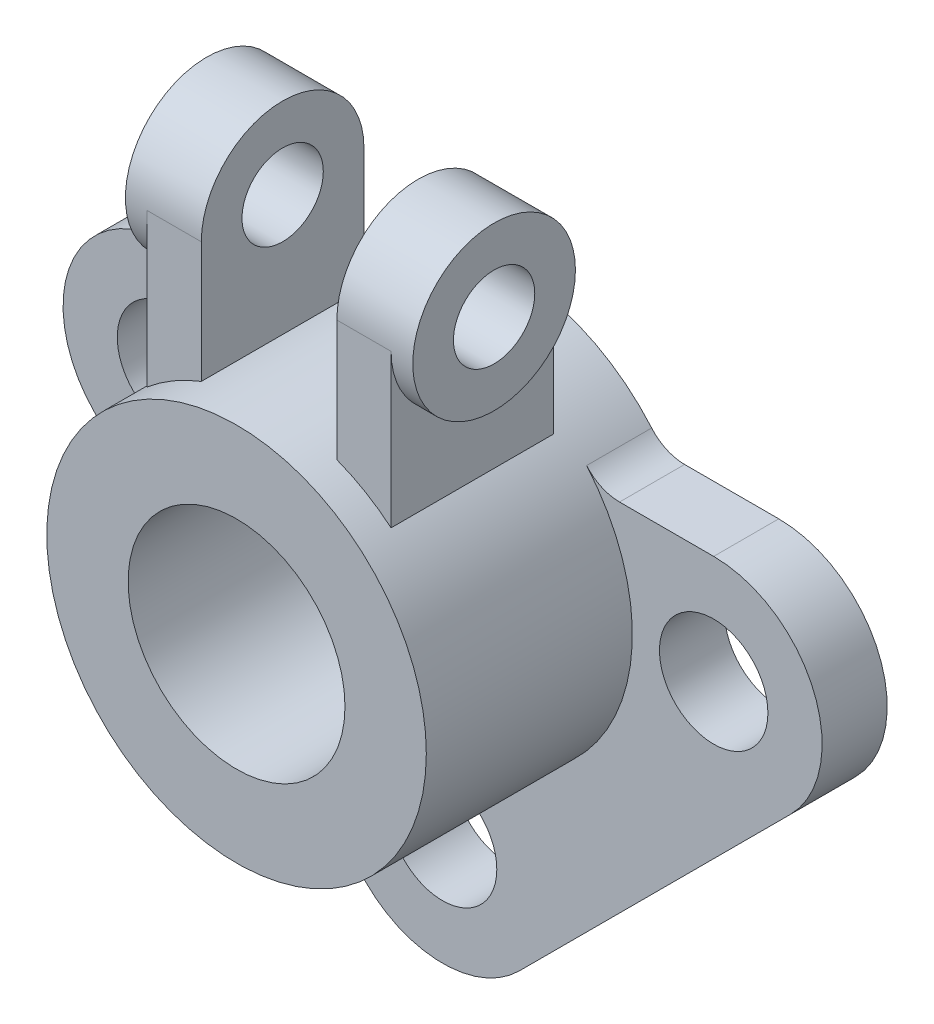
ISO-10303-21;
HEADER;
FILE_DESCRIPTION(('STEP AP214'),'2;1');
FILE_NAME('part.step','',(''),(''),'','','');
FILE_SCHEMA(('AUTOMOTIVE_DESIGN { 1 0 10303 214 1 1 1 1 }'));
ENDSEC;
DATA;
#1=APPLICATION_CONTEXT('core data for automotive mechanical design processes');
#2=APPLICATION_PROTOCOL_DEFINITION('international standard','automotive_design',2000,#1);
#3=PRODUCT_CONTEXT('',#1,'mechanical');
#4=PRODUCT('Part','Part','',(#3));
#5=PRODUCT_RELATED_PRODUCT_CATEGORY('part','',(#4));
#6=PRODUCT_DEFINITION_FORMATION('','',#4);
#7=PRODUCT_DEFINITION_CONTEXT('part definition',#1,'design');
#8=PRODUCT_DEFINITION('design','',#6,#7);
#9=PRODUCT_DEFINITION_SHAPE('','',#8);
#10=(LENGTH_UNIT() NAMED_UNIT(*) SI_UNIT(.MILLI.,.METRE.));
#11=(NAMED_UNIT(*) PLANE_ANGLE_UNIT() SI_UNIT($,.RADIAN.));
#12=(NAMED_UNIT(*) SI_UNIT($,.STERADIAN.) SOLID_ANGLE_UNIT());
#13=UNCERTAINTY_MEASURE_WITH_UNIT(LENGTH_MEASURE(1.E-05),#10,'distance_accuracy_value','');
#14=(GEOMETRIC_REPRESENTATION_CONTEXT(3) GLOBAL_UNCERTAINTY_ASSIGNED_CONTEXT((#13)) GLOBAL_UNIT_ASSIGNED_CONTEXT((#10,
#11,#12)) REPRESENTATION_CONTEXT('',''));
#15=CARTESIAN_POINT('',(0.,0.,0.));
#16=DIRECTION('',(0.,0.,1.));
#17=DIRECTION('',(1.,0.,0.));
#18=AXIS2_PLACEMENT_3D('',#15,#16,#17);
#19=CARTESIAN_POINT('',(22.5,0.,14.));
#20=DIRECTION('',(-1.,0.,0.));
#21=DIRECTION('',(0.,0.,1.));
#22=AXIS2_PLACEMENT_3D('',#19,#20,#21);
#23=PLANE('',#22);
#24=CARTESIAN_POINT('',(22.5,55.,29.));
#25=DIRECTION('',(1.,0.,0.));
#26=DIRECTION('',(0.,0.,-1.));
#27=AXIS2_PLACEMENT_3D('',#24,#25,#26);
#28=CIRCLE('',#27,15.);
#29=CARTESIAN_POINT('',(22.5,55.,44.));
#30=VERTEX_POINT('',#29);
#31=CARTESIAN_POINT('',(22.5,55.,14.));
#32=VERTEX_POINT('',#31);
#33=EDGE_CURVE('E219',#30,#32,#28,.T.);
#34=ORIENTED_EDGE('',*,*,#33,.F.);
#35=DIRECTION('',(0.,-1.,0.));
#36=VECTOR('',#35,1.);
#37=CARTESIAN_POINT('',(22.5,0.,44.));
#38=LINE('',#37,#36);
#39=CARTESIAN_POINT('',(22.5,26.809513236909,44.));
#40=VERTEX_POINT('',#39);
#41=EDGE_CURVE('E231',#30,#40,#38,.T.);
#42=ORIENTED_EDGE('',*,*,#41,.T.);
#43=DIRECTION('',(0.,0.,1.));
#44=VECTOR('',#43,1.);
#45=CARTESIAN_POINT('',(22.5,26.809513236909,14.));
#46=LINE('',#45,#44);
#47=CARTESIAN_POINT('',(22.5,26.809513236909,14.));
#48=VERTEX_POINT('',#47);
#49=EDGE_CURVE('E247',#48,#40,#46,.T.);
#50=ORIENTED_EDGE('',*,*,#49,.F.);
#51=DIRECTION('',(0.,-1.,0.));
#52=VECTOR('',#51,1.);
#53=CARTESIAN_POINT('',(22.5,0.,14.));
#54=LINE('',#53,#52);
#55=EDGE_CURVE('E232',#32,#48,#54,.T.);
#56=ORIENTED_EDGE('',*,*,#55,.F.);
#57=EDGE_LOOP('',(#34,#42,#50,#56));
#58=FACE_BOUND('',#57,.T.);
#59=ADVANCED_FACE('F57',(#58),#23,.F.);
#60=CARTESIAN_POINT('',(-22.5,0.,14.));
#61=DIRECTION('',(-1.,0.,0.));
#62=DIRECTION('',(0.,0.,1.));
#63=AXIS2_PLACEMENT_3D('',#60,#61,#62);
#64=PLANE('',#63);
#65=CARTESIAN_POINT('',(-22.5,55.,29.));
#66=DIRECTION('',(1.,0.,0.));
#67=DIRECTION('',(0.,0.,-1.));
#68=AXIS2_PLACEMENT_3D('',#65,#66,#67);
#69=CIRCLE('',#68,15.);
#70=CARTESIAN_POINT('',(-22.5,55.,44.));
#71=VERTEX_POINT('',#70);
#72=CARTESIAN_POINT('',(-22.5,55.,14.));
#73=VERTEX_POINT('',#72);
#74=EDGE_CURVE('E201',#71,#73,#69,.T.);
#75=ORIENTED_EDGE('',*,*,#74,.T.);
#76=DIRECTION('',(0.,-1.,0.));
#77=VECTOR('',#76,1.);
#78=CARTESIAN_POINT('',(-22.5,0.,14.));
#79=LINE('',#78,#77);
#80=CARTESIAN_POINT('',(-22.5,26.809513236909,14.));
#81=VERTEX_POINT('',#80);
#82=EDGE_CURVE('E182',#73,#81,#79,.T.);
#83=ORIENTED_EDGE('',*,*,#82,.T.);
#84=DIRECTION('',(0.,0.,1.));
#85=VECTOR('',#84,1.);
#86=CARTESIAN_POINT('',(-22.5,26.809513236909,14.));
#87=LINE('',#86,#85);
#88=CARTESIAN_POINT('',(-22.5,26.809513236909,44.));
#89=VERTEX_POINT('',#88);
#90=EDGE_CURVE('E260',#81,#89,#87,.T.);
#91=ORIENTED_EDGE('',*,*,#90,.T.);
#92=DIRECTION('',(0.,-1.,0.));
#93=VECTOR('',#92,1.);
#94=CARTESIAN_POINT('',(-22.5,0.,44.));
#95=LINE('',#94,#93);
#96=EDGE_CURVE('E207',#71,#89,#95,.T.);
#97=ORIENTED_EDGE('',*,*,#96,.F.);
#98=EDGE_LOOP('',(#75,#83,#91,#97));
#99=FACE_BOUND('',#98,.T.);
#100=ADVANCED_FACE('F206',(#99),#64,.T.);
#101=CARTESIAN_POINT('',(-12.5,0.,14.));
#102=DIRECTION('',(1.,0.,0.));
#103=DIRECTION('',(0.,0.,-1.));
#104=AXIS2_PLACEMENT_3D('',#101,#102,#103);
#105=PLANE('',#104);
#106=CARTESIAN_POINT('',(-12.5,55.,29.));
#107=DIRECTION('',(1.,0.,0.));
#108=DIRECTION('',(0.,0.,-1.));
#109=AXIS2_PLACEMENT_3D('',#106,#107,#108);
#110=CIRCLE('',#109,7.5);
#111=CARTESIAN_POINT('',(-12.5,55.,21.5));
#112=VERTEX_POINT('',#111);
#113=EDGE_CURVE('E228',#112,#112,#110,.T.);
#114=ORIENTED_EDGE('',*,*,#113,.F.);
#115=EDGE_LOOP('',(#114));
#116=FACE_BOUND('',#115,.T.);
#117=DIRECTION('',(0.,1.,0.));
#118=VECTOR('',#117,1.);
#119=CARTESIAN_POINT('',(-12.5,0.,14.));
#120=LINE('',#119,#118);
#121=CARTESIAN_POINT('',(-12.5,32.6917420765551,14.));
#122=VERTEX_POINT('',#121);
#123=CARTESIAN_POINT('',(-12.5,55.,14.));
#124=VERTEX_POINT('',#123);
#125=EDGE_CURVE('E195',#122,#124,#120,.T.);
#126=ORIENTED_EDGE('',*,*,#125,.T.);
#127=CARTESIAN_POINT('',(-12.5,55.,29.));
#128=DIRECTION('',(1.,0.,0.));
#129=DIRECTION('',(0.,0.,-1.));
#130=AXIS2_PLACEMENT_3D('',#127,#128,#129);
#131=CIRCLE('',#130,15.);
#132=CARTESIAN_POINT('',(-12.5,55.,44.));
#133=VERTEX_POINT('',#132);
#134=EDGE_CURVE('E203',#124,#133,#131,.T.);
#135=ORIENTED_EDGE('',*,*,#134,.T.);
#136=DIRECTION('',(0.,1.,0.));
#137=VECTOR('',#136,1.);
#138=CARTESIAN_POINT('',(-12.5,0.,44.));
#139=LINE('',#138,#137);
#140=CARTESIAN_POINT('',(-12.5,32.6917420765551,44.));
#141=VERTEX_POINT('',#140);
#142=EDGE_CURVE('E257',#141,#133,#139,.T.);
#143=ORIENTED_EDGE('',*,*,#142,.F.);
#144=DIRECTION('',(0.,0.,1.));
#145=VECTOR('',#144,1.);
#146=CARTESIAN_POINT('',(-12.5,32.6917420765551,14.));
#147=LINE('',#146,#145);
#148=EDGE_CURVE('E194',#122,#141,#147,.T.);
#149=ORIENTED_EDGE('',*,*,#148,.F.);
#150=EDGE_LOOP('',(#126,#135,#143,#149));
#151=FACE_BOUND('',#150,.T.);
#152=ADVANCED_FACE('F408',(#116,#151),#105,.T.);
#153=CARTESIAN_POINT('',(12.5,0.,14.));
#154=DIRECTION('',(1.,0.,0.));
#155=DIRECTION('',(0.,0.,-1.));
#156=AXIS2_PLACEMENT_3D('',#153,#154,#155);
#157=PLANE('',#156);
#158=CARTESIAN_POINT('',(12.5,55.,29.));
#159=DIRECTION('',(1.,0.,0.));
#160=DIRECTION('',(0.,0.,-1.));
#161=AXIS2_PLACEMENT_3D('',#158,#159,#160);
#162=CIRCLE('',#161,7.5);
#163=CARTESIAN_POINT('',(12.5,55.,21.5));
#164=VERTEX_POINT('',#163);
#165=EDGE_CURVE('E227',#164,#164,#162,.T.);
#166=ORIENTED_EDGE('',*,*,#165,.T.);
#167=EDGE_LOOP('',(#166));
#168=FACE_BOUND('',#167,.T.);
#169=CARTESIAN_POINT('',(12.5,55.,29.));
#170=DIRECTION('',(1.,0.,0.));
#171=DIRECTION('',(0.,0.,-1.));
#172=AXIS2_PLACEMENT_3D('',#169,#170,#171);
#173=CIRCLE('',#172,15.);
#174=CARTESIAN_POINT('',(12.5,55.,14.));
#175=VERTEX_POINT('',#174);
#176=CARTESIAN_POINT('',(12.5,55.,44.));
#177=VERTEX_POINT('',#176);
#178=EDGE_CURVE('E80',#175,#177,#173,.T.);
#179=ORIENTED_EDGE('',*,*,#178,.F.);
#180=DIRECTION('',(0.,1.,0.));
#181=VECTOR('',#180,1.);
#182=CARTESIAN_POINT('',(12.5,0.,14.));
#183=LINE('',#182,#181);
#184=CARTESIAN_POINT('',(12.5,32.6917420765551,14.));
#185=VERTEX_POINT('',#184);
#186=EDGE_CURVE('E234',#185,#175,#183,.T.);
#187=ORIENTED_EDGE('',*,*,#186,.F.);
#188=DIRECTION('',(0.,0.,1.));
#189=VECTOR('',#188,1.);
#190=CARTESIAN_POINT('',(12.5,32.6917420765551,14.));
#191=LINE('',#190,#189);
#192=CARTESIAN_POINT('',(12.5,32.6917420765551,44.));
#193=VERTEX_POINT('',#192);
#194=EDGE_CURVE('E240',#185,#193,#191,.T.);
#195=ORIENTED_EDGE('',*,*,#194,.T.);
#196=DIRECTION('',(0.,1.,0.));
#197=VECTOR('',#196,1.);
#198=CARTESIAN_POINT('',(12.5,0.,44.));
#199=LINE('',#198,#197);
#200=EDGE_CURVE('E242',#193,#177,#199,.T.);
#201=ORIENTED_EDGE('',*,*,#200,.T.);
#202=EDGE_LOOP('',(#179,#187,#195,#201));
#203=FACE_BOUND('',#202,.T.);
#204=ADVANCED_FACE('F386',(#168,#203),#157,.F.);
#205=CARTESIAN_POINT('',(0.,0.,50.));
#206=DIRECTION('',(0.,0.,-1.));
#207=DIRECTION('',(-1.,0.,0.));
#208=AXIS2_PLACEMENT_3D('',#205,#206,#207);
#209=CYLINDRICAL_SURFACE('',#208,35.);
#210=CARTESIAN_POINT('',(0.,0.,14.));
#211=DIRECTION('',(0.,0.,1.));
#212=DIRECTION('',(1.,0.,0.));
#213=AXIS2_PLACEMENT_3D('',#210,#211,#212);
#214=CIRCLE('',#213,35.);
#215=EDGE_CURVE('E189',#122,#81,#214,.T.);
#216=ORIENTED_EDGE('',*,*,#215,.F.);
#217=ORIENTED_EDGE('',*,*,#148,.T.);
#218=CARTESIAN_POINT('',(0.,0.,44.));
#219=DIRECTION('',(0.,0.,1.));
#220=DIRECTION('',(1.,0.,0.));
#221=AXIS2_PLACEMENT_3D('',#218,#219,#220);
#222=CIRCLE('',#221,35.);
#223=EDGE_CURVE('E250',#141,#89,#222,.T.);
#224=ORIENTED_EDGE('',*,*,#223,.T.);
#225=ORIENTED_EDGE('',*,*,#90,.F.);
#226=EDGE_LOOP('',(#216,#217,#224,#225));
#227=FACE_BOUND('',#226,.T.);
#228=CARTESIAN_POINT('',(0.,0.,50.));
#229=DIRECTION('',(0.,0.,1.));
#230=DIRECTION('',(1.,0.,0.));
#231=AXIS2_PLACEMENT_3D('',#228,#229,#230);
#232=CIRCLE('',#231,35.);
#233=CARTESIAN_POINT('',(35.,0.,50.));
#234=VERTEX_POINT('',#233);
#235=EDGE_CURVE('E268',#234,#234,#232,.T.);
#236=ORIENTED_EDGE('',*,*,#235,.F.);
#237=EDGE_LOOP('',(#236));
#238=FACE_BOUND('',#237,.T.);
#239=CARTESIAN_POINT('',(0.,0.,0.));
#240=DIRECTION('',(0.,0.,1.));
#241=DIRECTION('',(1.,0.,0.));
#242=AXIS2_PLACEMENT_3D('',#239,#240,#241);
#243=CIRCLE('',#242,35.);
#244=CARTESIAN_POINT('',(26.5628330475733,22.7906976744186,0.));
#245=VERTEX_POINT('',#244);
#246=CARTESIAN_POINT('',(-26.5628330475733,22.7906976744186,0.));
#247=VERTEX_POINT('',#246);
#248=EDGE_CURVE('E269',#245,#247,#243,.T.);
#249=ORIENTED_EDGE('',*,*,#248,.T.);
#250=DIRECTION('',(0.,0.,-1.));
#251=VECTOR('',#250,1.);
#252=CARTESIAN_POINT('',(-26.5628330475733,22.7906976744186,50.));
#253=LINE('',#252,#251);
#254=CARTESIAN_POINT('',(-26.5628330475733,22.7906976744186,12.));
#255=VERTEX_POINT('',#254);
#256=EDGE_CURVE('E357',#247,#255,#253,.F.);
#257=ORIENTED_EDGE('',*,*,#256,.T.);
#258=CARTESIAN_POINT('',(0.,0.,12.));
#259=DIRECTION('',(0.,0.,1.));
#260=DIRECTION('',(1.,0.,0.));
#261=AXIS2_PLACEMENT_3D('',#258,#259,#260);
#262=CIRCLE('',#261,35.);
#263=CARTESIAN_POINT('',(26.5628330475733,22.7906976744186,12.));
#264=VERTEX_POINT('',#263);
#265=EDGE_CURVE('E284',#255,#264,#262,.T.);
#266=ORIENTED_EDGE('',*,*,#265,.T.);
#267=DIRECTION('',(0.,0.,-1.));
#268=VECTOR('',#267,1.);
#269=CARTESIAN_POINT('',(26.5628330475733,22.7906976744186,50.));
#270=LINE('',#269,#268);
#271=EDGE_CURVE('E354',#264,#245,#270,.T.);
#272=ORIENTED_EDGE('',*,*,#271,.T.);
#273=EDGE_LOOP('',(#249,#257,#266,#272));
#274=FACE_BOUND('',#273,.T.);
#275=CARTESIAN_POINT('',(0.,0.,14.));
#276=DIRECTION('',(0.,0.,1.));
#277=DIRECTION('',(1.,0.,0.));
#278=AXIS2_PLACEMENT_3D('',#275,#276,#277);
#279=CIRCLE('',#278,35.);
#280=EDGE_CURVE('E238',#48,#185,#279,.T.);
#281=ORIENTED_EDGE('',*,*,#280,.F.);
#282=ORIENTED_EDGE('',*,*,#49,.T.);
#283=CARTESIAN_POINT('',(0.,0.,44.));
#284=DIRECTION('',(0.,0.,1.));
#285=DIRECTION('',(1.,0.,0.));
#286=AXIS2_PLACEMENT_3D('',#283,#284,#285);
#287=CIRCLE('',#286,35.);
#288=EDGE_CURVE('E235',#40,#193,#287,.T.);
#289=ORIENTED_EDGE('',*,*,#288,.T.);
#290=ORIENTED_EDGE('',*,*,#194,.F.);
#291=EDGE_LOOP('',(#281,#282,#289,#290));
#292=FACE_BOUND('',#291,.T.);
#293=ADVANCED_FACE('F388',(#227,#238,#274,#292),#209,.T.);
#294=CARTESIAN_POINT('',(0.,20.,12.));
#295=DIRECTION('',(0.,-1.,0.));
#296=DIRECTION('',(1.,0.,0.));
#297=AXIS2_PLACEMENT_3D('',#294,#295,#296);
#298=PLANE('',#297);
#299=DIRECTION('',(-1.,0.,0.));
#300=VECTOR('',#299,1.);
#301=CARTESIAN_POINT('',(0.,20.,12.));
#302=LINE('',#301,#300);
#303=CARTESIAN_POINT('',(-32.6343377441614,20.,12.));
#304=VERTEX_POINT('',#303);
#305=CARTESIAN_POINT('',(-50.,20.,12.));
#306=VERTEX_POINT('',#305);
#307=EDGE_CURVE('E286',#304,#306,#302,.T.);
#308=ORIENTED_EDGE('',*,*,#307,.F.);
#309=DIRECTION('',(0.,0.,1.));
#310=VECTOR('',#309,1.);
#311=CARTESIAN_POINT('',(-32.6343377441614,20.,0.));
#312=LINE('',#311,#310);
#313=CARTESIAN_POINT('',(-32.6343377441614,20.,0.));
#314=VERTEX_POINT('',#313);
#315=EDGE_CURVE('E351',#304,#314,#312,.F.);
#316=ORIENTED_EDGE('',*,*,#315,.T.);
#317=DIRECTION('',(-1.,0.,0.));
#318=VECTOR('',#317,1.);
#319=CARTESIAN_POINT('',(0.,20.,0.));
#320=LINE('',#319,#318);
#321=CARTESIAN_POINT('',(-50.,20.,0.));
#322=VERTEX_POINT('',#321);
#323=EDGE_CURVE('E314',#314,#322,#320,.T.);
#324=ORIENTED_EDGE('',*,*,#323,.T.);
#325=DIRECTION('',(0.,0.,-1.));
#326=VECTOR('',#325,1.);
#327=CARTESIAN_POINT('',(-50.,20.,12.));
#328=LINE('',#327,#326);
#329=EDGE_CURVE('E348',#306,#322,#328,.T.);
#330=ORIENTED_EDGE('',*,*,#329,.F.);
#331=EDGE_LOOP('',(#308,#316,#324,#330));
#332=FACE_BOUND('',#331,.T.);
#333=ADVANCED_FACE('F426',(#332),#298,.F.);
#334=CARTESIAN_POINT('',(-50.,0.,12.));
#335=DIRECTION('',(0.,0.,-1.));
#336=DIRECTION('',(-1.,0.,0.));
#337=AXIS2_PLACEMENT_3D('',#334,#335,#336);
#338=CYLINDRICAL_SURFACE('',#337,20.);
#339=CARTESIAN_POINT('',(-50.,0.,0.));
#340=DIRECTION('',(0.,0.,1.));
#341=DIRECTION('',(1.,0.,0.));
#342=AXIS2_PLACEMENT_3D('',#339,#340,#341);
#343=CIRCLE('',#342,20.);
#344=CARTESIAN_POINT('',(-64.142135623731,-14.142135623731,0.));
#345=VERTEX_POINT('',#344);
#346=EDGE_CURVE('E316',#322,#345,#343,.T.);
#347=ORIENTED_EDGE('',*,*,#346,.T.);
#348=DIRECTION('',(0.,0.,-1.));
#349=VECTOR('',#348,1.);
#350=CARTESIAN_POINT('',(-64.142135623731,-14.142135623731,12.));
#351=LINE('',#350,#349);
#352=CARTESIAN_POINT('',(-64.142135623731,-14.142135623731,12.));
#353=VERTEX_POINT('',#352);
#354=EDGE_CURVE('E345',#353,#345,#351,.T.);
#355=ORIENTED_EDGE('',*,*,#354,.F.);
#356=CARTESIAN_POINT('',(-50.,0.,12.));
#357=DIRECTION('',(0.,0.,1.));
#358=DIRECTION('',(1.,0.,0.));
#359=AXIS2_PLACEMENT_3D('',#356,#357,#358);
#360=CIRCLE('',#359,20.);
#361=EDGE_CURVE('E288',#306,#353,#360,.T.);
#362=ORIENTED_EDGE('',*,*,#361,.F.);
#363=ORIENTED_EDGE('',*,*,#329,.T.);
#364=EDGE_LOOP('',(#347,#355,#362,#363));
#365=FACE_BOUND('',#364,.T.);
#366=ADVANCED_FACE('F464',(#365),#338,.T.);
#367=CARTESIAN_POINT('',(-39.142135623731,-39.142135623731,12.));
#368=DIRECTION('',(0.707106781186547,0.707106781186547,0.));
#369=DIRECTION('',(-0.707106781186548,0.707106781186548,0.));
#370=AXIS2_PLACEMENT_3D('',#367,#368,#369);
#371=PLANE('',#370);
#372=DIRECTION('',(0.707106781186548,-0.707106781186548,0.));
#373=VECTOR('',#372,1.);
#374=CARTESIAN_POINT('',(-39.142135623731,-39.142135623731,0.));
#375=LINE('',#374,#373);
#376=CARTESIAN_POINT('',(-14.142135623731,-64.142135623731,0.));
#377=VERTEX_POINT('',#376);
#378=EDGE_CURVE('E319',#345,#377,#375,.T.);
#379=ORIENTED_EDGE('',*,*,#378,.T.);
#380=DIRECTION('',(0.,0.,-1.));
#381=VECTOR('',#380,1.);
#382=CARTESIAN_POINT('',(-14.142135623731,-64.142135623731,12.));
#383=LINE('',#382,#381);
#384=CARTESIAN_POINT('',(-14.142135623731,-64.142135623731,12.));
#385=VERTEX_POINT('',#384);
#386=EDGE_CURVE('E343',#385,#377,#383,.T.);
#387=ORIENTED_EDGE('',*,*,#386,.F.);
#388=DIRECTION('',(0.707106781186548,-0.707106781186548,0.));
#389=VECTOR('',#388,1.);
#390=CARTESIAN_POINT('',(-39.142135623731,-39.142135623731,12.));
#391=LINE('',#390,#389);
#392=EDGE_CURVE('E291',#353,#385,#391,.T.);
#393=ORIENTED_EDGE('',*,*,#392,.F.);
#394=ORIENTED_EDGE('',*,*,#354,.T.);
#395=EDGE_LOOP('',(#379,#387,#393,#394));
#396=FACE_BOUND('',#395,.T.);
#397=ADVANCED_FACE('F460',(#396),#371,.F.);
#398=CARTESIAN_POINT('',(0.,-50.,12.));
#399=DIRECTION('',(0.,0.,-1.));
#400=DIRECTION('',(-1.,0.,0.));
#401=AXIS2_PLACEMENT_3D('',#398,#399,#400);
#402=CYLINDRICAL_SURFACE('',#401,20.);
#403=CARTESIAN_POINT('',(0.,-50.,0.));
#404=DIRECTION('',(0.,0.,1.));
#405=DIRECTION('',(1.,0.,0.));
#406=AXIS2_PLACEMENT_3D('',#403,#404,#405);
#407=CIRCLE('',#406,20.);
#408=CARTESIAN_POINT('',(14.142135623731,-64.142135623731,0.));
#409=VERTEX_POINT('',#408);
#410=EDGE_CURVE('E322',#409,#377,#407,.F.);
#411=ORIENTED_EDGE('',*,*,#410,.F.);
#412=DIRECTION('',(0.,0.,-1.));
#413=VECTOR('',#412,1.);
#414=CARTESIAN_POINT('',(14.142135623731,-64.142135623731,12.));
#415=LINE('',#414,#413);
#416=CARTESIAN_POINT('',(14.142135623731,-64.142135623731,12.));
#417=VERTEX_POINT('',#416);
#418=EDGE_CURVE('E341',#417,#409,#415,.T.);
#419=ORIENTED_EDGE('',*,*,#418,.F.);
#420=CARTESIAN_POINT('',(0.,-50.,12.));
#421=DIRECTION('',(0.,0.,1.));
#422=DIRECTION('',(1.,0.,0.));
#423=AXIS2_PLACEMENT_3D('',#420,#421,#422);
#424=CIRCLE('',#423,20.);
#425=EDGE_CURVE('E293',#417,#385,#424,.F.);
#426=ORIENTED_EDGE('',*,*,#425,.T.);
#427=ORIENTED_EDGE('',*,*,#386,.T.);
#428=EDGE_LOOP('',(#411,#419,#426,#427));
#429=FACE_BOUND('',#428,.T.);
#430=ADVANCED_FACE('F456',(#429),#402,.T.);
#431=CARTESIAN_POINT('',(39.142135623731,-39.142135623731,12.));
#432=DIRECTION('',(-0.707106781186547,0.707106781186547,0.));
#433=DIRECTION('',(-0.707106781186548,-0.707106781186548,0.));
#434=AXIS2_PLACEMENT_3D('',#431,#432,#433);
#435=PLANE('',#434);
#436=DIRECTION('',(0.707106781186548,0.707106781186548,0.));
#437=VECTOR('',#436,1.);
#438=CARTESIAN_POINT('',(39.142135623731,-39.142135623731,0.));
#439=LINE('',#438,#437);
#440=CARTESIAN_POINT('',(64.142135623731,-14.1421356237309,0.));
#441=VERTEX_POINT('',#440);
#442=EDGE_CURVE('E325',#409,#441,#439,.T.);
#443=ORIENTED_EDGE('',*,*,#442,.T.);
#444=DIRECTION('',(0.,0.,-1.));
#445=VECTOR('',#444,1.);
#446=CARTESIAN_POINT('',(64.142135623731,-14.1421356237309,12.));
#447=LINE('',#446,#445);
#448=CARTESIAN_POINT('',(64.142135623731,-14.1421356237309,12.));
#449=VERTEX_POINT('',#448);
#450=EDGE_CURVE('E338',#449,#441,#447,.T.);
#451=ORIENTED_EDGE('',*,*,#450,.F.);
#452=DIRECTION('',(0.707106781186548,0.707106781186548,0.));
#453=VECTOR('',#452,1.);
#454=CARTESIAN_POINT('',(39.142135623731,-39.142135623731,12.));
#455=LINE('',#454,#453);
#456=EDGE_CURVE('E296',#417,#449,#455,.T.);
#457=ORIENTED_EDGE('',*,*,#456,.F.);
#458=ORIENTED_EDGE('',*,*,#418,.T.);
#459=EDGE_LOOP('',(#443,#451,#457,#458));
#460=FACE_BOUND('',#459,.T.);
#461=ADVANCED_FACE('F452',(#460),#435,.F.);
#462=CARTESIAN_POINT('',(50.,0.,12.));
#463=DIRECTION('',(0.,0.,-1.));
#464=DIRECTION('',(-1.,0.,0.));
#465=AXIS2_PLACEMENT_3D('',#462,#463,#464);
#466=CYLINDRICAL_SURFACE('',#465,20.);
#467=CARTESIAN_POINT('',(50.,0.,0.));
#468=DIRECTION('',(0.,0.,1.));
#469=DIRECTION('',(1.,0.,0.));
#470=AXIS2_PLACEMENT_3D('',#467,#468,#469);
#471=CIRCLE('',#470,20.);
#472=CARTESIAN_POINT('',(50.,20.,0.));
#473=VERTEX_POINT('',#472);
#474=EDGE_CURVE('E328',#441,#473,#471,.T.);
#475=ORIENTED_EDGE('',*,*,#474,.T.);
#476=DIRECTION('',(0.,0.,-1.));
#477=VECTOR('',#476,1.);
#478=CARTESIAN_POINT('',(50.,20.,12.));
#479=LINE('',#478,#477);
#480=CARTESIAN_POINT('',(50.,20.,12.));
#481=VERTEX_POINT('',#480);
#482=EDGE_CURVE('E308',#481,#473,#479,.T.);
#483=ORIENTED_EDGE('',*,*,#482,.F.);
#484=CARTESIAN_POINT('',(50.,0.,12.));
#485=DIRECTION('',(0.,0.,1.));
#486=DIRECTION('',(1.,0.,0.));
#487=AXIS2_PLACEMENT_3D('',#484,#485,#486);
#488=CIRCLE('',#487,20.);
#489=EDGE_CURVE('E299',#449,#481,#488,.T.);
#490=ORIENTED_EDGE('',*,*,#489,.F.);
#491=ORIENTED_EDGE('',*,*,#450,.T.);
#492=EDGE_LOOP('',(#475,#483,#490,#491));
#493=FACE_BOUND('',#492,.T.);
#494=ADVANCED_FACE('F448',(#493),#466,.T.);
#495=CARTESIAN_POINT('',(0.,20.,12.));
#496=DIRECTION('',(0.,-1.,0.));
#497=DIRECTION('',(1.,0.,0.));
#498=AXIS2_PLACEMENT_3D('',#495,#496,#497);
#499=PLANE('',#498);
#500=DIRECTION('',(-1.,0.,0.));
#501=VECTOR('',#500,1.);
#502=CARTESIAN_POINT('',(0.,20.,0.));
#503=LINE('',#502,#501);
#504=CARTESIAN_POINT('',(32.6343377441614,20.,0.));
#505=VERTEX_POINT('',#504);
#506=EDGE_CURVE('E331',#473,#505,#503,.T.);
#507=ORIENTED_EDGE('',*,*,#506,.T.);
#508=DIRECTION('',(0.,0.,1.));
#509=VECTOR('',#508,1.);
#510=CARTESIAN_POINT('',(32.6343377441614,20.,12.));
#511=LINE('',#510,#509);
#512=CARTESIAN_POINT('',(32.6343377441614,20.,12.));
#513=VERTEX_POINT('',#512);
#514=EDGE_CURVE('E360',#505,#513,#511,.T.);
#515=ORIENTED_EDGE('',*,*,#514,.T.);
#516=DIRECTION('',(-1.,0.,0.));
#517=VECTOR('',#516,1.);
#518=CARTESIAN_POINT('',(0.,20.,12.));
#519=LINE('',#518,#517);
#520=EDGE_CURVE('E302',#481,#513,#519,.T.);
#521=ORIENTED_EDGE('',*,*,#520,.F.);
#522=ORIENTED_EDGE('',*,*,#482,.T.);
#523=EDGE_LOOP('',(#507,#515,#521,#522));
#524=FACE_BOUND('',#523,.T.);
#525=ADVANCED_FACE('F444',(#524),#499,.F.);
#526=CARTESIAN_POINT('',(50.,0.,12.));
#527=DIRECTION('',(0.,0.,-1.));
#528=DIRECTION('',(-1.,0.,0.));
#529=AXIS2_PLACEMENT_3D('',#526,#527,#528);
#530=CYLINDRICAL_SURFACE('',#529,9.99999999999999);
#531=CARTESIAN_POINT('',(50.,0.,12.));
#532=DIRECTION('',(0.,0.,1.));
#533=DIRECTION('',(1.,0.,0.));
#534=AXIS2_PLACEMENT_3D('',#531,#532,#533);
#535=CIRCLE('',#534,9.99999999999999);
#536=CARTESIAN_POINT('',(60.,0.,12.));
#537=VERTEX_POINT('',#536);
#538=EDGE_CURVE('E280',#537,#537,#535,.T.);
#539=ORIENTED_EDGE('',*,*,#538,.T.);
#540=EDGE_LOOP('',(#539));
#541=FACE_BOUND('',#540,.T.);
#542=CARTESIAN_POINT('',(50.,0.,0.));
#543=DIRECTION('',(0.,0.,1.));
#544=DIRECTION('',(1.,0.,0.));
#545=AXIS2_PLACEMENT_3D('',#542,#543,#544);
#546=CIRCLE('',#545,9.99999999999999);
#547=CARTESIAN_POINT('',(60.,0.,0.));
#548=VERTEX_POINT('',#547);
#549=EDGE_CURVE('E311',#548,#548,#546,.T.);
#550=ORIENTED_EDGE('',*,*,#549,.F.);
#551=EDGE_LOOP('',(#550));
#552=FACE_BOUND('',#551,.T.);
#553=ADVANCED_FACE('F447',(#541,#552),#530,.F.);
#554=CARTESIAN_POINT('',(0.,-50.,12.));
#555=DIRECTION('',(0.,0.,-1.));
#556=DIRECTION('',(-1.,0.,0.));
#557=AXIS2_PLACEMENT_3D('',#554,#555,#556);
#558=CYLINDRICAL_SURFACE('',#557,10.);
#559=CARTESIAN_POINT('',(0.,-50.,12.));
#560=DIRECTION('',(0.,0.,1.));
#561=DIRECTION('',(1.,0.,0.));
#562=AXIS2_PLACEMENT_3D('',#559,#560,#561);
#563=CIRCLE('',#562,10.);
#564=CARTESIAN_POINT('',(10.,-50.,12.));
#565=VERTEX_POINT('',#564);
#566=EDGE_CURVE('E277',#565,#565,#563,.T.);
#567=ORIENTED_EDGE('',*,*,#566,.T.);
#568=EDGE_LOOP('',(#567));
#569=FACE_BOUND('',#568,.T.);
#570=CARTESIAN_POINT('',(0.,-50.,0.));
#571=DIRECTION('',(0.,0.,1.));
#572=DIRECTION('',(1.,0.,0.));
#573=AXIS2_PLACEMENT_3D('',#570,#571,#572);
#574=CIRCLE('',#573,10.);
#575=CARTESIAN_POINT('',(10.,-50.,0.));
#576=VERTEX_POINT('',#575);
#577=EDGE_CURVE('E272',#576,#576,#574,.T.);
#578=ORIENTED_EDGE('',*,*,#577,.F.);
#579=EDGE_LOOP('',(#578));
#580=FACE_BOUND('',#579,.T.);
#581=ADVANCED_FACE('F442',(#569,#580),#558,.F.);
#582=CARTESIAN_POINT('',(-50.,0.,12.));
#583=DIRECTION('',(0.,0.,-1.));
#584=DIRECTION('',(-1.,0.,0.));
#585=AXIS2_PLACEMENT_3D('',#582,#583,#584);
#586=CYLINDRICAL_SURFACE('',#585,10.);
#587=CARTESIAN_POINT('',(-50.,0.,12.));
#588=DIRECTION('',(0.,0.,1.));
#589=DIRECTION('',(1.,0.,0.));
#590=AXIS2_PLACEMENT_3D('',#587,#588,#589);
#591=CIRCLE('',#590,10.);
#592=CARTESIAN_POINT('',(-40.,0.,12.));
#593=VERTEX_POINT('',#592);
#594=EDGE_CURVE('E305',#593,#593,#591,.T.);
#595=ORIENTED_EDGE('',*,*,#594,.T.);
#596=EDGE_LOOP('',(#595));
#597=FACE_BOUND('',#596,.T.);
#598=CARTESIAN_POINT('',(-50.,0.,0.));
#599=DIRECTION('',(0.,0.,1.));
#600=DIRECTION('',(1.,0.,0.));
#601=AXIS2_PLACEMENT_3D('',#598,#599,#600);
#602=CIRCLE('',#601,10.);
#603=CARTESIAN_POINT('',(-40.,0.,0.));
#604=VERTEX_POINT('',#603);
#605=EDGE_CURVE('E281',#604,#604,#602,.T.);
#606=ORIENTED_EDGE('',*,*,#605,.F.);
#607=EDGE_LOOP('',(#606));
#608=FACE_BOUND('',#607,.T.);
#609=ADVANCED_FACE('F435',(#597,#608),#586,.F.);
#610=CARTESIAN_POINT('',(0.,0.,12.));
#611=DIRECTION('',(0.,0.,1.));
#612=DIRECTION('',(1.,0.,0.));
#613=AXIS2_PLACEMENT_3D('',#610,#611,#612);
#614=PLANE('',#613);
#615=ORIENTED_EDGE('',*,*,#566,.F.);
#616=EDGE_LOOP('',(#615));
#617=FACE_BOUND('',#616,.T.);
#618=ORIENTED_EDGE('',*,*,#538,.F.);
#619=EDGE_LOOP('',(#618));
#620=FACE_BOUND('',#619,.T.);
#621=ORIENTED_EDGE('',*,*,#265,.F.);
#622=CARTESIAN_POINT('',(-32.6343377441614,28.,12.));
#623=DIRECTION('',(0.,0.,1.));
#624=DIRECTION('',(1.,0.,0.));
#625=AXIS2_PLACEMENT_3D('',#622,#623,#624);
#626=CIRCLE('',#625,8.);
#627=EDGE_CURVE('E364',#255,#304,#626,.F.);
#628=ORIENTED_EDGE('',*,*,#627,.T.);
#629=ORIENTED_EDGE('',*,*,#307,.T.);
#630=ORIENTED_EDGE('',*,*,#361,.T.);
#631=ORIENTED_EDGE('',*,*,#392,.T.);
#632=ORIENTED_EDGE('',*,*,#425,.F.);
#633=ORIENTED_EDGE('',*,*,#456,.T.);
#634=ORIENTED_EDGE('',*,*,#489,.T.);
#635=ORIENTED_EDGE('',*,*,#520,.T.);
#636=CARTESIAN_POINT('',(32.6343377441614,28.,12.));
#637=DIRECTION('',(0.,0.,1.));
#638=DIRECTION('',(1.,0.,0.));
#639=AXIS2_PLACEMENT_3D('',#636,#637,#638);
#640=CIRCLE('',#639,8.);
#641=EDGE_CURVE('E368',#513,#264,#640,.F.);
#642=ORIENTED_EDGE('',*,*,#641,.T.);
#643=EDGE_LOOP('',(#621,#628,#629,#630,#631,#632,#633,#634,#635,#642));
#644=FACE_BOUND('',#643,.T.);
#645=ORIENTED_EDGE('',*,*,#594,.F.);
#646=EDGE_LOOP('',(#645));
#647=FACE_BOUND('',#646,.T.);
#648=ADVANCED_FACE('F432',(#617,#620,#644,#647),#614,.T.);
#649=CARTESIAN_POINT('',(0.,0.,0.));
#650=DIRECTION('',(0.,0.,1.));
#651=DIRECTION('',(1.,0.,0.));
#652=AXIS2_PLACEMENT_3D('',#649,#650,#651);
#653=PLANE('',#652);
#654=ORIENTED_EDGE('',*,*,#577,.T.);
#655=EDGE_LOOP('',(#654));
#656=FACE_BOUND('',#655,.T.);
#657=ORIENTED_EDGE('',*,*,#549,.T.);
#658=EDGE_LOOP('',(#657));
#659=FACE_BOUND('',#658,.T.);
#660=ORIENTED_EDGE('',*,*,#323,.F.);
#661=CARTESIAN_POINT('',(-32.6343377441614,28.,0.));
#662=DIRECTION('',(0.,0.,1.));
#663=DIRECTION('',(1.,0.,0.));
#664=AXIS2_PLACEMENT_3D('',#661,#662,#663);
#665=CIRCLE('',#664,8.);
#666=EDGE_CURVE('E362',#314,#247,#665,.T.);
#667=ORIENTED_EDGE('',*,*,#666,.T.);
#668=ORIENTED_EDGE('',*,*,#248,.F.);
#669=CARTESIAN_POINT('',(32.6343377441614,28.,0.));
#670=DIRECTION('',(0.,0.,1.));
#671=DIRECTION('',(1.,0.,0.));
#672=AXIS2_PLACEMENT_3D('',#669,#670,#671);
#673=CIRCLE('',#672,8.);
#674=EDGE_CURVE('E366',#245,#505,#673,.T.);
#675=ORIENTED_EDGE('',*,*,#674,.T.);
#676=ORIENTED_EDGE('',*,*,#506,.F.);
#677=ORIENTED_EDGE('',*,*,#474,.F.);
#678=ORIENTED_EDGE('',*,*,#442,.F.);
#679=ORIENTED_EDGE('',*,*,#410,.T.);
#680=ORIENTED_EDGE('',*,*,#378,.F.);
#681=ORIENTED_EDGE('',*,*,#346,.F.);
#682=EDGE_LOOP('',(#660,#667,#668,#675,#676,#677,#678,#679,#680,#681));
#683=FACE_BOUND('',#682,.T.);
#684=ORIENTED_EDGE('',*,*,#605,.T.);
#685=EDGE_LOOP('',(#684));
#686=FACE_BOUND('',#685,.T.);
#687=CARTESIAN_POINT('',(0.,0.,0.));
#688=DIRECTION('',(0.,0.,1.));
#689=DIRECTION('',(1.,0.,0.));
#690=AXIS2_PLACEMENT_3D('',#687,#688,#689);
#691=CIRCLE('',#690,20.);
#692=CARTESIAN_POINT('',(20.,0.,0.));
#693=VERTEX_POINT('',#692);
#694=EDGE_CURVE('E262',#693,#693,#691,.T.);
#695=ORIENTED_EDGE('',*,*,#694,.T.);
#696=EDGE_LOOP('',(#695));
#697=FACE_BOUND('',#696,.T.);
#698=ADVANCED_FACE('F430',(#656,#659,#683,#686,#697),#653,.F.);
#699=CARTESIAN_POINT('',(0.,0.,50.));
#700=DIRECTION('',(0.,0.,-1.));
#701=DIRECTION('',(-1.,0.,0.));
#702=AXIS2_PLACEMENT_3D('',#699,#700,#701);
#703=CYLINDRICAL_SURFACE('',#702,20.);
#704=CARTESIAN_POINT('',(0.,0.,50.));
#705=DIRECTION('',(0.,0.,1.));
#706=DIRECTION('',(1.,0.,0.));
#707=AXIS2_PLACEMENT_3D('',#704,#705,#706);
#708=CIRCLE('',#707,20.);
#709=CARTESIAN_POINT('',(20.,0.,50.));
#710=VERTEX_POINT('',#709);
#711=EDGE_CURVE('E265',#710,#710,#708,.T.);
#712=ORIENTED_EDGE('',*,*,#711,.T.);
#713=EDGE_LOOP('',(#712));
#714=FACE_BOUND('',#713,.T.);
#715=ORIENTED_EDGE('',*,*,#694,.F.);
#716=EDGE_LOOP('',(#715));
#717=FACE_BOUND('',#716,.T.);
#718=ADVANCED_FACE('F422',(#714,#717),#703,.F.);
#719=CARTESIAN_POINT('',(0.,0.,50.));
#720=DIRECTION('',(0.,0.,1.));
#721=DIRECTION('',(1.,0.,0.));
#722=AXIS2_PLACEMENT_3D('',#719,#720,#721);
#723=PLANE('',#722);
#724=ORIENTED_EDGE('',*,*,#711,.F.);
#725=EDGE_LOOP('',(#724));
#726=FACE_BOUND('',#725,.T.);
#727=ORIENTED_EDGE('',*,*,#235,.T.);
#728=EDGE_LOOP('',(#727));
#729=FACE_BOUND('',#728,.T.);
#730=ADVANCED_FACE('F418',(#726,#729),#723,.T.);
#731=CARTESIAN_POINT('',(-32.6343377441614,28.,50.));
#732=DIRECTION('',(0.,0.,-1.));
#733=DIRECTION('',(-1.,0.,0.));
#734=AXIS2_PLACEMENT_3D('',#731,#732,#733);
#735=CYLINDRICAL_SURFACE('',#734,8.);
#736=ORIENTED_EDGE('',*,*,#627,.F.);
#737=ORIENTED_EDGE('',*,*,#256,.F.);
#738=ORIENTED_EDGE('',*,*,#666,.F.);
#739=ORIENTED_EDGE('',*,*,#315,.F.);
#740=EDGE_LOOP('',(#736,#737,#738,#739));
#741=FACE_BOUND('',#740,.T.);
#742=ADVANCED_FACE('F421',(#741),#735,.F.);
#743=CARTESIAN_POINT('',(32.6343377441614,28.,50.));
#744=DIRECTION('',(0.,0.,-1.));
#745=DIRECTION('',(-1.,0.,0.));
#746=AXIS2_PLACEMENT_3D('',#743,#744,#745);
#747=CYLINDRICAL_SURFACE('',#746,8.);
#748=ORIENTED_EDGE('',*,*,#641,.F.);
#749=ORIENTED_EDGE('',*,*,#514,.F.);
#750=ORIENTED_EDGE('',*,*,#674,.F.);
#751=ORIENTED_EDGE('',*,*,#271,.F.);
#752=EDGE_LOOP('',(#748,#749,#750,#751));
#753=FACE_BOUND('',#752,.T.);
#754=ADVANCED_FACE('F59',(#753),#747,.F.);
#755=CARTESIAN_POINT('',(0.,0.,14.));
#756=DIRECTION('',(0.,0.,1.));
#757=DIRECTION('',(1.,0.,0.));
#758=AXIS2_PLACEMENT_3D('',#755,#756,#757);
#759=PLANE('',#758);
#760=ORIENTED_EDGE('',*,*,#82,.F.);
#761=DIRECTION('',(1.,0.,0.));
#762=VECTOR('',#761,1.);
#763=CARTESIAN_POINT('',(-70.,55.,14.));
#764=LINE('',#763,#762);
#765=EDGE_CURVE('E186',#73,#124,#764,.T.);
#766=ORIENTED_EDGE('',*,*,#765,.T.);
#767=ORIENTED_EDGE('',*,*,#125,.F.);
#768=ORIENTED_EDGE('',*,*,#215,.T.);
#769=EDGE_LOOP('',(#760,#766,#767,#768));
#770=FACE_BOUND('',#769,.T.);
#771=ADVANCED_FACE('F184',(#770),#759,.F.);
#772=CARTESIAN_POINT('',(0.,0.,44.));
#773=DIRECTION('',(0.,0.,1.));
#774=DIRECTION('',(1.,0.,0.));
#775=AXIS2_PLACEMENT_3D('',#772,#773,#774);
#776=PLANE('',#775);
#777=DIRECTION('',(1.,0.,0.));
#778=VECTOR('',#777,1.);
#779=CARTESIAN_POINT('',(-70.,55.,44.));
#780=LINE('',#779,#778);
#781=EDGE_CURVE('E72',#71,#133,#780,.T.);
#782=ORIENTED_EDGE('',*,*,#781,.F.);
#783=ORIENTED_EDGE('',*,*,#96,.T.);
#784=ORIENTED_EDGE('',*,*,#223,.F.);
#785=ORIENTED_EDGE('',*,*,#142,.T.);
#786=EDGE_LOOP('',(#782,#783,#784,#785));
#787=FACE_BOUND('',#786,.T.);
#788=ADVANCED_FACE('F400',(#787),#776,.T.);
#789=CARTESIAN_POINT('',(0.,0.,14.));
#790=DIRECTION('',(0.,0.,1.));
#791=DIRECTION('',(1.,0.,0.));
#792=AXIS2_PLACEMENT_3D('',#789,#790,#791);
#793=PLANE('',#792);
#794=ORIENTED_EDGE('',*,*,#186,.T.);
#795=DIRECTION('',(1.,0.,0.));
#796=VECTOR('',#795,1.);
#797=CARTESIAN_POINT('',(-70.,55.,14.));
#798=LINE('',#797,#796);
#799=EDGE_CURVE('E12',#175,#32,#798,.T.);
#800=ORIENTED_EDGE('',*,*,#799,.T.);
#801=ORIENTED_EDGE('',*,*,#55,.T.);
#802=ORIENTED_EDGE('',*,*,#280,.T.);
#803=EDGE_LOOP('',(#794,#800,#801,#802));
#804=FACE_BOUND('',#803,.T.);
#805=ADVANCED_FACE('F382',(#804),#793,.F.);
#806=CARTESIAN_POINT('',(0.,0.,44.));
#807=DIRECTION('',(0.,0.,1.));
#808=DIRECTION('',(1.,0.,0.));
#809=AXIS2_PLACEMENT_3D('',#806,#807,#808);
#810=PLANE('',#809);
#811=DIRECTION('',(1.,0.,0.));
#812=VECTOR('',#811,1.);
#813=CARTESIAN_POINT('',(-70.,55.,44.));
#814=LINE('',#813,#812);
#815=EDGE_CURVE('E65',#177,#30,#814,.T.);
#816=ORIENTED_EDGE('',*,*,#815,.F.);
#817=ORIENTED_EDGE('',*,*,#200,.F.);
#818=ORIENTED_EDGE('',*,*,#288,.F.);
#819=ORIENTED_EDGE('',*,*,#41,.F.);
#820=EDGE_LOOP('',(#816,#817,#818,#819));
#821=FACE_BOUND('',#820,.T.);
#822=ADVANCED_FACE('F389',(#821),#810,.T.);
#823=CARTESIAN_POINT('',(-70.,55.,29.));
#824=DIRECTION('',(1.,0.,0.));
#825=DIRECTION('',(0.,0.,-1.));
#826=AXIS2_PLACEMENT_3D('',#823,#824,#825);
#827=CYLINDRICAL_SURFACE('',#826,7.5);
#828=ORIENTED_EDGE('',*,*,#165,.F.);
#829=EDGE_LOOP('',(#828));
#830=FACE_BOUND('',#829,.T.);
#831=CARTESIAN_POINT('',(26.5,55.,29.));
#832=DIRECTION('',(1.,0.,0.));
#833=DIRECTION('',(0.,0.,-1.));
#834=AXIS2_PLACEMENT_3D('',#831,#832,#833);
#835=CIRCLE('',#834,7.5);
#836=CARTESIAN_POINT('',(26.5,55.,21.5));
#837=VERTEX_POINT('',#836);
#838=EDGE_CURVE('E212',#837,#837,#835,.T.);
#839=ORIENTED_EDGE('',*,*,#838,.T.);
#840=EDGE_LOOP('',(#839));
#841=FACE_BOUND('',#840,.T.);
#842=ADVANCED_FACE('F391',(#830,#841),#827,.F.);
#843=ORIENTED_EDGE('',*,*,#113,.T.);
#844=EDGE_LOOP('',(#843));
#845=FACE_BOUND('',#844,.T.);
#846=CARTESIAN_POINT('',(-26.5,55.,29.));
#847=DIRECTION('',(1.,0.,0.));
#848=DIRECTION('',(0.,0.,-1.));
#849=AXIS2_PLACEMENT_3D('',#846,#847,#848);
#850=CIRCLE('',#849,7.5);
#851=CARTESIAN_POINT('',(-26.5,55.,21.5));
#852=VERTEX_POINT('',#851);
#853=EDGE_CURVE('E209',#852,#852,#850,.T.);
#854=ORIENTED_EDGE('',*,*,#853,.F.);
#855=EDGE_LOOP('',(#854));
#856=FACE_BOUND('',#855,.T.);
#857=ADVANCED_FACE('F397',(#845,#856),#827,.F.);
#858=CARTESIAN_POINT('',(-70.,55.,29.));
#859=DIRECTION('',(1.,0.,0.));
#860=DIRECTION('',(0.,0.,-1.));
#861=AXIS2_PLACEMENT_3D('',#858,#859,#860);
#862=CYLINDRICAL_SURFACE('',#861,15.);
#863=ORIENTED_EDGE('',*,*,#178,.T.);
#864=ORIENTED_EDGE('',*,*,#815,.T.);
#865=ORIENTED_EDGE('',*,*,#33,.T.);
#866=ORIENTED_EDGE('',*,*,#799,.F.);
#867=EDGE_LOOP('',(#863,#864,#865,#866));
#868=FACE_BOUND('',#867,.T.);
#869=CARTESIAN_POINT('',(26.5,55.,29.));
#870=DIRECTION('',(1.,0.,0.));
#871=DIRECTION('',(0.,0.,-1.));
#872=AXIS2_PLACEMENT_3D('',#869,#870,#871);
#873=CIRCLE('',#872,15.);
#874=CARTESIAN_POINT('',(26.5,55.,14.));
#875=VERTEX_POINT('',#874);
#876=EDGE_CURVE('E204',#875,#875,#873,.T.);
#877=ORIENTED_EDGE('',*,*,#876,.F.);
#878=EDGE_LOOP('',(#877));
#879=FACE_BOUND('',#878,.T.);
#880=ADVANCED_FACE('F373',(#868,#879),#862,.T.);
#881=ORIENTED_EDGE('',*,*,#781,.T.);
#882=ORIENTED_EDGE('',*,*,#134,.F.);
#883=ORIENTED_EDGE('',*,*,#765,.F.);
#884=ORIENTED_EDGE('',*,*,#74,.F.);
#885=EDGE_LOOP('',(#881,#882,#883,#884));
#886=FACE_BOUND('',#885,.T.);
#887=CARTESIAN_POINT('',(-26.5,55.,29.));
#888=DIRECTION('',(1.,0.,0.));
#889=DIRECTION('',(0.,0.,-1.));
#890=AXIS2_PLACEMENT_3D('',#887,#888,#889);
#891=CIRCLE('',#890,15.);
#892=CARTESIAN_POINT('',(-26.5,55.,14.));
#893=VERTEX_POINT('',#892);
#894=EDGE_CURVE('E208',#893,#893,#891,.T.);
#895=ORIENTED_EDGE('',*,*,#894,.T.);
#896=EDGE_LOOP('',(#895));
#897=FACE_BOUND('',#896,.T.);
#898=ADVANCED_FACE('F199',(#886,#897),#862,.T.);
#899=CARTESIAN_POINT('',(26.5,55.,29.));
#900=DIRECTION('',(1.,0.,0.));
#901=DIRECTION('',(0.,0.,-1.));
#902=AXIS2_PLACEMENT_3D('',#899,#900,#901);
#903=PLANE('',#902);
#904=ORIENTED_EDGE('',*,*,#876,.T.);
#905=EDGE_LOOP('',(#904));
#906=FACE_BOUND('',#905,.T.);
#907=ORIENTED_EDGE('',*,*,#838,.F.);
#908=EDGE_LOOP('',(#907));
#909=FACE_BOUND('',#908,.T.);
#910=ADVANCED_FACE('F559',(#906,#909),#903,.T.);
#911=CARTESIAN_POINT('',(-26.5,55.,29.));
#912=DIRECTION('',(-1.,0.,0.));
#913=DIRECTION('',(0.,0.,-1.));
#914=AXIS2_PLACEMENT_3D('',#911,#912,#913);
#915=PLANE('',#914);
#916=ORIENTED_EDGE('',*,*,#853,.T.);
#917=EDGE_LOOP('',(#916));
#918=FACE_BOUND('',#917,.T.);
#919=ORIENTED_EDGE('',*,*,#894,.F.);
#920=EDGE_LOOP('',(#919));
#921=FACE_BOUND('',#920,.T.);
#922=ADVANCED_FACE('F562',(#918,#921),#915,.T.);
#923=CLOSED_SHELL('',(#59,#100,#152,#204,#293,#333,#366,#397,#430,#461,#494,#525,#553,#581,#609,
#648,#698,#718,#730,#742,#754,#771,#788,#805,#822,#842,#857,#880,#898,#910,#922));
#924=MANIFOLD_SOLID_BREP('B2',#923);
#925=ADVANCED_BREP_SHAPE_REPRESENTATION('',(#18,#924),#14);
#926=SHAPE_DEFINITION_REPRESENTATION(#9,#925);
ENDSEC;
END-ISO-10303-21;
